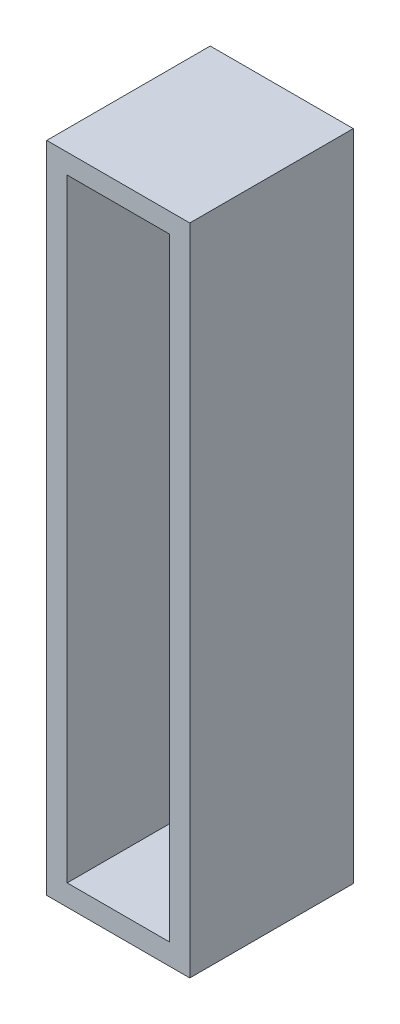
ISO-10303-21;
HEADER;
FILE_DESCRIPTION(('STEP AP214'),'2;1');
FILE_NAME('part.step','',(''),(''),'','','');
FILE_SCHEMA(('AUTOMOTIVE_DESIGN { 1 0 10303 214 1 1 1 1 }'));
ENDSEC;
DATA;
#1=APPLICATION_CONTEXT('core data for automotive mechanical design processes');
#2=APPLICATION_PROTOCOL_DEFINITION('international standard','automotive_design',2000,#1);
#3=PRODUCT_CONTEXT('',#1,'mechanical');
#4=PRODUCT('Part','Part','',(#3));
#5=PRODUCT_RELATED_PRODUCT_CATEGORY('part','',(#4));
#6=PRODUCT_DEFINITION_FORMATION('','',#4);
#7=PRODUCT_DEFINITION_CONTEXT('part definition',#1,'design');
#8=PRODUCT_DEFINITION('design','',#6,#7);
#9=PRODUCT_DEFINITION_SHAPE('','',#8);
#10=(LENGTH_UNIT() NAMED_UNIT(*) SI_UNIT(.MILLI.,.METRE.));
#11=(NAMED_UNIT(*) PLANE_ANGLE_UNIT() SI_UNIT($,.RADIAN.));
#12=(NAMED_UNIT(*) SI_UNIT($,.STERADIAN.) SOLID_ANGLE_UNIT());
#13=UNCERTAINTY_MEASURE_WITH_UNIT(LENGTH_MEASURE(1.E-05),#10,'distance_accuracy_value','');
#14=(GEOMETRIC_REPRESENTATION_CONTEXT(3) GLOBAL_UNCERTAINTY_ASSIGNED_CONTEXT((#13)) GLOBAL_UNIT_ASSIGNED_CONTEXT((#10,
#11,#12)) REPRESENTATION_CONTEXT('',''));
#15=CARTESIAN_POINT('',(0.,0.,0.));
#16=DIRECTION('',(0.,0.,1.));
#17=DIRECTION('',(1.,0.,0.));
#18=AXIS2_PLACEMENT_3D('',#15,#16,#17);
#19=CARTESIAN_POINT('',(0.,0.,10.16));
#20=DIRECTION('',(0.,0.,1.));
#21=DIRECTION('',(1.,0.,0.));
#22=AXIS2_PLACEMENT_3D('',#19,#20,#21);
#23=PLANE('',#22);
#24=DIRECTION('',(-1.,0.,0.));
#25=VECTOR('',#24,1.);
#26=CARTESIAN_POINT('',(5.89359375000001,21.7090625,10.16));
#27=LINE('',#26,#25);
#28=CARTESIAN_POINT('',(5.89359375000001,21.7090625,10.16));
#29=VERTEX_POINT('',#28);
#30=CARTESIAN_POINT('',(-2.99640625,21.7090625,10.16));
#31=VERTEX_POINT('',#30);
#32=EDGE_CURVE('E134',#29,#31,#27,.T.);
#33=ORIENTED_EDGE('',*,*,#32,.T.);
#34=DIRECTION('',(0.,-1.,0.));
#35=VECTOR('',#34,1.);
#36=CARTESIAN_POINT('',(-2.99640625,21.7090625,10.16));
#37=LINE('',#36,#35);
#38=CARTESIAN_POINT('',(-2.99640624999999,-18.9309375,10.16));
#39=VERTEX_POINT('',#38);
#40=EDGE_CURVE('E137',#31,#39,#37,.T.);
#41=ORIENTED_EDGE('',*,*,#40,.T.);
#42=DIRECTION('',(1.,0.,0.));
#43=VECTOR('',#42,1.);
#44=CARTESIAN_POINT('',(-2.99640624999999,-18.9309375,10.16));
#45=LINE('',#44,#43);
#46=CARTESIAN_POINT('',(5.89359375000001,-18.9309375,10.16));
#47=VERTEX_POINT('',#46);
#48=EDGE_CURVE('E140',#39,#47,#45,.T.);
#49=ORIENTED_EDGE('',*,*,#48,.T.);
#50=DIRECTION('',(0.,1.,0.));
#51=VECTOR('',#50,1.);
#52=CARTESIAN_POINT('',(5.89359375000001,-18.9309375,10.16));
#53=LINE('',#52,#51);
#54=EDGE_CURVE('E142',#47,#29,#53,.T.);
#55=ORIENTED_EDGE('',*,*,#54,.T.);
#56=EDGE_LOOP('',(#33,#41,#49,#55));
#57=FACE_BOUND('',#56,.T.);
#58=DIRECTION('',(0.,-1.,0.));
#59=VECTOR('',#58,1.);
#60=CARTESIAN_POINT('',(-1.72640625,20.47875,10.16));
#61=LINE('',#60,#59);
#62=CARTESIAN_POINT('',(-1.72640625,20.47875,10.16));
#63=VERTEX_POINT('',#62);
#64=CARTESIAN_POINT('',(-1.72640624999999,-17.62125,10.16));
#65=VERTEX_POINT('',#64);
#66=EDGE_CURVE('E106',#63,#65,#61,.T.);
#67=ORIENTED_EDGE('',*,*,#66,.F.);
#68=DIRECTION('',(-1.,0.,0.));
#69=VECTOR('',#68,1.);
#70=CARTESIAN_POINT('',(4.62359375000001,20.47875,10.16));
#71=LINE('',#70,#69);
#72=CARTESIAN_POINT('',(4.62359375000001,20.47875,10.16));
#73=VERTEX_POINT('',#72);
#74=EDGE_CURVE('E98',#73,#63,#71,.T.);
#75=ORIENTED_EDGE('',*,*,#74,.F.);
#76=DIRECTION('',(0.,1.,0.));
#77=VECTOR('',#76,1.);
#78=CARTESIAN_POINT('',(4.62359375000001,-17.62125,10.16));
#79=LINE('',#78,#77);
#80=CARTESIAN_POINT('',(4.62359375000001,-17.62125,10.16));
#81=VERTEX_POINT('',#80);
#82=EDGE_CURVE('E120',#81,#73,#79,.T.);
#83=ORIENTED_EDGE('',*,*,#82,.F.);
#84=DIRECTION('',(1.,0.,0.));
#85=VECTOR('',#84,1.);
#86=CARTESIAN_POINT('',(-1.72640624999999,-17.62125,10.16));
#87=LINE('',#86,#85);
#88=EDGE_CURVE('E118',#65,#81,#87,.T.);
#89=ORIENTED_EDGE('',*,*,#88,.F.);
#90=EDGE_LOOP('',(#67,#75,#83,#89));
#91=FACE_BOUND('',#90,.T.);
#92=ADVANCED_FACE('F33',(#57,#91),#23,.T.);
#93=CARTESIAN_POINT('',(0.,0.,0.));
#94=DIRECTION('',(0.,0.,1.));
#95=DIRECTION('',(1.,0.,0.));
#96=AXIS2_PLACEMENT_3D('',#93,#94,#95);
#97=PLANE('',#96);
#98=DIRECTION('',(-1.,0.,0.));
#99=VECTOR('',#98,1.);
#100=CARTESIAN_POINT('',(5.89359375000001,21.7090625,0.));
#101=LINE('',#100,#99);
#102=CARTESIAN_POINT('',(5.89359375000001,21.7090625,0.));
#103=VERTEX_POINT('',#102);
#104=CARTESIAN_POINT('',(-2.99640625,21.7090625,0.));
#105=VERTEX_POINT('',#104);
#106=EDGE_CURVE('E114',#103,#105,#101,.T.);
#107=ORIENTED_EDGE('',*,*,#106,.F.);
#108=DIRECTION('',(0.,1.,0.));
#109=VECTOR('',#108,1.);
#110=CARTESIAN_POINT('',(5.89359375000001,-18.9309375,0.));
#111=LINE('',#110,#109);
#112=CARTESIAN_POINT('',(5.89359375000001,-18.9309375,0.));
#113=VERTEX_POINT('',#112);
#114=EDGE_CURVE('E138',#113,#103,#111,.T.);
#115=ORIENTED_EDGE('',*,*,#114,.F.);
#116=DIRECTION('',(1.,0.,0.));
#117=VECTOR('',#116,1.);
#118=CARTESIAN_POINT('',(-2.99640624999999,-18.9309375,0.));
#119=LINE('',#118,#117);
#120=CARTESIAN_POINT('',(-2.99640624999999,-18.9309375,0.));
#121=VERTEX_POINT('',#120);
#122=EDGE_CURVE('E149',#121,#113,#119,.T.);
#123=ORIENTED_EDGE('',*,*,#122,.F.);
#124=DIRECTION('',(0.,-1.,0.));
#125=VECTOR('',#124,1.);
#126=CARTESIAN_POINT('',(-2.99640625,21.7090625,0.));
#127=LINE('',#126,#125);
#128=EDGE_CURVE('E147',#105,#121,#127,.T.);
#129=ORIENTED_EDGE('',*,*,#128,.F.);
#130=EDGE_LOOP('',(#107,#115,#123,#129));
#131=FACE_BOUND('',#130,.T.);
#132=DIRECTION('',(-1.,0.,0.));
#133=VECTOR('',#132,1.);
#134=CARTESIAN_POINT('',(4.62359375000001,20.47875,0.));
#135=LINE('',#134,#133);
#136=CARTESIAN_POINT('',(4.62359375000001,20.47875,0.));
#137=VERTEX_POINT('',#136);
#138=CARTESIAN_POINT('',(-1.72640625,20.47875,0.));
#139=VERTEX_POINT('',#138);
#140=EDGE_CURVE('E56',#137,#139,#135,.T.);
#141=ORIENTED_EDGE('',*,*,#140,.T.);
#142=DIRECTION('',(0.,-1.,0.));
#143=VECTOR('',#142,1.);
#144=CARTESIAN_POINT('',(-1.72640625,20.47875,0.));
#145=LINE('',#144,#143);
#146=CARTESIAN_POINT('',(-1.72640624999999,-17.62125,0.));
#147=VERTEX_POINT('',#146);
#148=EDGE_CURVE('E113',#139,#147,#145,.T.);
#149=ORIENTED_EDGE('',*,*,#148,.T.);
#150=DIRECTION('',(1.,0.,0.));
#151=VECTOR('',#150,1.);
#152=CARTESIAN_POINT('',(-1.72640624999999,-17.62125,0.));
#153=LINE('',#152,#151);
#154=CARTESIAN_POINT('',(4.62359375000001,-17.62125,0.));
#155=VERTEX_POINT('',#154);
#156=EDGE_CURVE('E126',#147,#155,#153,.T.);
#157=ORIENTED_EDGE('',*,*,#156,.T.);
#158=DIRECTION('',(0.,1.,0.));
#159=VECTOR('',#158,1.);
#160=CARTESIAN_POINT('',(4.62359375000001,-17.62125,0.));
#161=LINE('',#160,#159);
#162=EDGE_CURVE('E107',#155,#137,#161,.T.);
#163=ORIENTED_EDGE('',*,*,#162,.T.);
#164=EDGE_LOOP('',(#141,#149,#157,#163));
#165=FACE_BOUND('',#164,.T.);
#166=ADVANCED_FACE('F167',(#131,#165),#97,.F.);
#167=CARTESIAN_POINT('',(5.89359375000001,21.7090625,10.16));
#168=DIRECTION('',(0.,-1.,0.));
#169=DIRECTION('',(0.,0.,-1.));
#170=AXIS2_PLACEMENT_3D('',#167,#168,#169);
#171=PLANE('',#170);
#172=ORIENTED_EDGE('',*,*,#106,.T.);
#173=DIRECTION('',(0.,0.,-1.));
#174=VECTOR('',#173,1.);
#175=CARTESIAN_POINT('',(-2.99640625,21.7090625,10.16));
#176=LINE('',#175,#174);
#177=EDGE_CURVE('E11',#31,#105,#176,.T.);
#178=ORIENTED_EDGE('',*,*,#177,.F.);
#179=ORIENTED_EDGE('',*,*,#32,.F.);
#180=DIRECTION('',(0.,0.,-1.));
#181=VECTOR('',#180,1.);
#182=CARTESIAN_POINT('',(5.89359375000001,21.7090625,10.16));
#183=LINE('',#182,#181);
#184=EDGE_CURVE('E144',#29,#103,#183,.T.);
#185=ORIENTED_EDGE('',*,*,#184,.T.);
#186=EDGE_LOOP('',(#172,#178,#179,#185));
#187=FACE_BOUND('',#186,.T.);
#188=ADVANCED_FACE('F35',(#187),#171,.F.);
#189=CARTESIAN_POINT('',(-2.99640625,21.7090625,10.16));
#190=DIRECTION('',(1.,0.,0.));
#191=DIRECTION('',(0.,1.,0.));
#192=AXIS2_PLACEMENT_3D('',#189,#190,#191);
#193=PLANE('',#192);
#194=ORIENTED_EDGE('',*,*,#128,.T.);
#195=DIRECTION('',(0.,0.,-1.));
#196=VECTOR('',#195,1.);
#197=CARTESIAN_POINT('',(-2.99640624999999,-18.9309375,10.16));
#198=LINE('',#197,#196);
#199=EDGE_CURVE('E41',#39,#121,#198,.T.);
#200=ORIENTED_EDGE('',*,*,#199,.F.);
#201=ORIENTED_EDGE('',*,*,#40,.F.);
#202=ORIENTED_EDGE('',*,*,#177,.T.);
#203=EDGE_LOOP('',(#194,#200,#201,#202));
#204=FACE_BOUND('',#203,.T.);
#205=ADVANCED_FACE('F177',(#204),#193,.F.);
#206=CARTESIAN_POINT('',(-2.99640624999999,-18.9309375,10.16));
#207=DIRECTION('',(0.,1.,0.));
#208=DIRECTION('',(0.,0.,1.));
#209=AXIS2_PLACEMENT_3D('',#206,#207,#208);
#210=PLANE('',#209);
#211=ORIENTED_EDGE('',*,*,#122,.T.);
#212=DIRECTION('',(0.,0.,-1.));
#213=VECTOR('',#212,1.);
#214=CARTESIAN_POINT('',(5.89359375000001,-18.9309375,10.16));
#215=LINE('',#214,#213);
#216=EDGE_CURVE('E154',#47,#113,#215,.T.);
#217=ORIENTED_EDGE('',*,*,#216,.F.);
#218=ORIENTED_EDGE('',*,*,#48,.F.);
#219=ORIENTED_EDGE('',*,*,#199,.T.);
#220=EDGE_LOOP('',(#211,#217,#218,#219));
#221=FACE_BOUND('',#220,.T.);
#222=ADVANCED_FACE('F161',(#221),#210,.F.);
#223=CARTESIAN_POINT('',(5.89359375000001,-18.9309375,10.16));
#224=DIRECTION('',(-1.,0.,0.));
#225=DIRECTION('',(0.,0.,1.));
#226=AXIS2_PLACEMENT_3D('',#223,#224,#225);
#227=PLANE('',#226);
#228=ORIENTED_EDGE('',*,*,#114,.T.);
#229=ORIENTED_EDGE('',*,*,#184,.F.);
#230=ORIENTED_EDGE('',*,*,#54,.F.);
#231=ORIENTED_EDGE('',*,*,#216,.T.);
#232=EDGE_LOOP('',(#228,#229,#230,#231));
#233=FACE_BOUND('',#232,.T.);
#234=ADVANCED_FACE('F171',(#233),#227,.F.);
#235=CARTESIAN_POINT('',(4.62359375000001,20.47875,10.16));
#236=DIRECTION('',(0.,-1.,0.));
#237=DIRECTION('',(0.,0.,-1.));
#238=AXIS2_PLACEMENT_3D('',#235,#236,#237);
#239=PLANE('',#238);
#240=ORIENTED_EDGE('',*,*,#140,.F.);
#241=DIRECTION('',(0.,0.,-1.));
#242=VECTOR('',#241,1.);
#243=CARTESIAN_POINT('',(4.62359375000001,20.47875,10.16));
#244=LINE('',#243,#242);
#245=EDGE_CURVE('E102',#73,#137,#244,.T.);
#246=ORIENTED_EDGE('',*,*,#245,.F.);
#247=ORIENTED_EDGE('',*,*,#74,.T.);
#248=DIRECTION('',(0.,0.,-1.));
#249=VECTOR('',#248,1.);
#250=CARTESIAN_POINT('',(-1.72640625,20.47875,10.16));
#251=LINE('',#250,#249);
#252=EDGE_CURVE('E101',#63,#139,#251,.T.);
#253=ORIENTED_EDGE('',*,*,#252,.T.);
#254=EDGE_LOOP('',(#240,#246,#247,#253));
#255=FACE_BOUND('',#254,.T.);
#256=ADVANCED_FACE('F100',(#255),#239,.T.);
#257=CARTESIAN_POINT('',(-1.72640625,20.47875,10.16));
#258=DIRECTION('',(1.,0.,0.));
#259=DIRECTION('',(0.,1.,0.));
#260=AXIS2_PLACEMENT_3D('',#257,#258,#259);
#261=PLANE('',#260);
#262=ORIENTED_EDGE('',*,*,#148,.F.);
#263=ORIENTED_EDGE('',*,*,#252,.F.);
#264=ORIENTED_EDGE('',*,*,#66,.T.);
#265=DIRECTION('',(0.,0.,-1.));
#266=VECTOR('',#265,1.);
#267=CARTESIAN_POINT('',(-1.72640624999999,-17.62125,10.16));
#268=LINE('',#267,#266);
#269=EDGE_CURVE('E115',#65,#147,#268,.T.);
#270=ORIENTED_EDGE('',*,*,#269,.T.);
#271=EDGE_LOOP('',(#262,#263,#264,#270));
#272=FACE_BOUND('',#271,.T.);
#273=ADVANCED_FACE('F110',(#272),#261,.T.);
#274=CARTESIAN_POINT('',(-1.72640624999999,-17.62125,10.16));
#275=DIRECTION('',(0.,1.,0.));
#276=DIRECTION('',(0.,0.,1.));
#277=AXIS2_PLACEMENT_3D('',#274,#275,#276);
#278=PLANE('',#277);
#279=ORIENTED_EDGE('',*,*,#156,.F.);
#280=ORIENTED_EDGE('',*,*,#269,.F.);
#281=ORIENTED_EDGE('',*,*,#88,.T.);
#282=DIRECTION('',(0.,0.,-1.));
#283=VECTOR('',#282,1.);
#284=CARTESIAN_POINT('',(4.62359375000001,-17.62125,10.16));
#285=LINE('',#284,#283);
#286=EDGE_CURVE('E48',#81,#155,#285,.T.);
#287=ORIENTED_EDGE('',*,*,#286,.T.);
#288=EDGE_LOOP('',(#279,#280,#281,#287));
#289=FACE_BOUND('',#288,.T.);
#290=ADVANCED_FACE('F200',(#289),#278,.T.);
#291=CARTESIAN_POINT('',(4.62359375000001,-17.62125,10.16));
#292=DIRECTION('',(-1.,0.,0.));
#293=DIRECTION('',(0.,0.,1.));
#294=AXIS2_PLACEMENT_3D('',#291,#292,#293);
#295=PLANE('',#294);
#296=ORIENTED_EDGE('',*,*,#162,.F.);
#297=ORIENTED_EDGE('',*,*,#286,.F.);
#298=ORIENTED_EDGE('',*,*,#82,.T.);
#299=ORIENTED_EDGE('',*,*,#245,.T.);
#300=EDGE_LOOP('',(#296,#297,#298,#299));
#301=FACE_BOUND('',#300,.T.);
#302=ADVANCED_FACE('F204',(#301),#295,.T.);
#303=CLOSED_SHELL('',(#92,#166,#188,#205,#222,#234,#256,#273,#290,#302));
#304=MANIFOLD_SOLID_BREP('B2',#303);
#305=ADVANCED_BREP_SHAPE_REPRESENTATION('',(#18,#304),#14);
#306=SHAPE_DEFINITION_REPRESENTATION(#9,#305);
ENDSEC;
END-ISO-10303-21;
